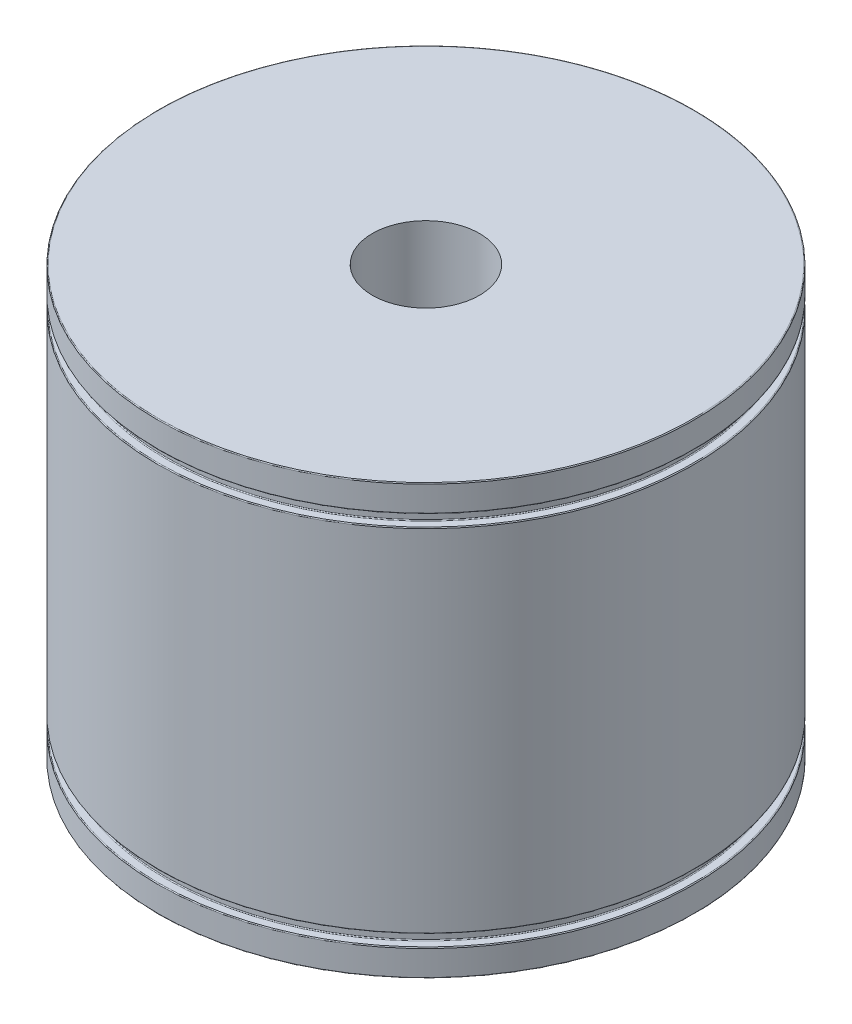
ISO-10303-21;
HEADER;
FILE_DESCRIPTION(('STEP AP214'),'2;1');
FILE_NAME('part.step','',(''),(''),'','','');
FILE_SCHEMA(('AUTOMOTIVE_DESIGN { 1 0 10303 214 1 1 1 1 }'));
ENDSEC;
DATA;
#1=APPLICATION_CONTEXT('core data for automotive mechanical design processes');
#2=APPLICATION_PROTOCOL_DEFINITION('international standard','automotive_design',2000,#1);
#3=PRODUCT_CONTEXT('',#1,'mechanical');
#4=PRODUCT('Part','Part','',(#3));
#5=PRODUCT_RELATED_PRODUCT_CATEGORY('part','',(#4));
#6=PRODUCT_DEFINITION_FORMATION('','',#4);
#7=PRODUCT_DEFINITION_CONTEXT('part definition',#1,'design');
#8=PRODUCT_DEFINITION('design','',#6,#7);
#9=PRODUCT_DEFINITION_SHAPE('','',#8);
#10=(LENGTH_UNIT() NAMED_UNIT(*) SI_UNIT(.MILLI.,.METRE.));
#11=(NAMED_UNIT(*) PLANE_ANGLE_UNIT() SI_UNIT($,.RADIAN.));
#12=(NAMED_UNIT(*) SI_UNIT($,.STERADIAN.) SOLID_ANGLE_UNIT());
#13=UNCERTAINTY_MEASURE_WITH_UNIT(LENGTH_MEASURE(1.E-05),#10,'distance_accuracy_value','');
#14=(GEOMETRIC_REPRESENTATION_CONTEXT(3) GLOBAL_UNCERTAINTY_ASSIGNED_CONTEXT((#13)) GLOBAL_UNIT_ASSIGNED_CONTEXT((#10,
#11,#12)) REPRESENTATION_CONTEXT('',''));
#15=CARTESIAN_POINT('',(0.,0.,0.));
#16=DIRECTION('',(0.,0.,1.));
#17=DIRECTION('',(1.,0.,0.));
#18=AXIS2_PLACEMENT_3D('',#15,#16,#17);
#19=CARTESIAN_POINT('',(0.,25.4,0.));
#20=DIRECTION('',(0.,1.,0.));
#21=DIRECTION('',(0.,0.,1.));
#22=AXIS2_PLACEMENT_3D('',#19,#20,#21);
#23=CYLINDRICAL_SURFACE('',#22,6.35000000000001);
#24=CARTESIAN_POINT('',(0.,-25.4,0.));
#25=DIRECTION('',(0.,1.,0.));
#26=DIRECTION('',(0.,0.,1.));
#27=AXIS2_PLACEMENT_3D('',#24,#25,#26);
#28=CIRCLE('',#27,6.35000000000001);
#29=CARTESIAN_POINT('',(0.,-25.4,6.35000000000001));
#30=VERTEX_POINT('',#29);
#31=EDGE_CURVE('E747',#30,#30,#28,.F.);
#32=ORIENTED_EDGE('',*,*,#31,.T.);
#33=EDGE_LOOP('',(#32));
#34=FACE_BOUND('',#33,.T.);
#35=CARTESIAN_POINT('',(0.,25.4,0.));
#36=DIRECTION('',(0.,1.,0.));
#37=DIRECTION('',(0.,0.,1.));
#38=AXIS2_PLACEMENT_3D('',#35,#36,#37);
#39=CIRCLE('',#38,6.35000000000001);
#40=CARTESIAN_POINT('',(0.,25.4,6.35000000000001));
#41=VERTEX_POINT('',#40);
#42=EDGE_CURVE('E100',#41,#41,#39,.T.);
#43=ORIENTED_EDGE('',*,*,#42,.T.);
#44=EDGE_LOOP('',(#43));
#45=FACE_BOUND('',#44,.T.);
#46=ADVANCED_FACE('F17',(#34,#45),#23,.F.);
#47=CARTESIAN_POINT('',(31.65,-25.4,0.));
#48=DIRECTION('',(0.,1.,0.));
#49=DIRECTION('',(0.,0.,1.));
#50=AXIS2_PLACEMENT_3D('',#47,#48,#49);
#51=PLANE('',#50);
#52=ORIENTED_EDGE('',*,*,#31,.F.);
#53=EDGE_LOOP('',(#52));
#54=FACE_BOUND('',#53,.T.);
#55=CARTESIAN_POINT('',(0.,-25.4,0.));
#56=DIRECTION('',(0.,1.,0.));
#57=DIRECTION('',(0.,0.,-1.));
#58=AXIS2_PLACEMENT_3D('',#55,#56,#57);
#59=CIRCLE('',#58,31.65);
#60=CARTESIAN_POINT('',(0.,-25.4,-31.65));
#61=VERTEX_POINT('',#60);
#62=CARTESIAN_POINT('',(0.,-25.4,31.65));
#63=VERTEX_POINT('',#62);
#64=EDGE_CURVE('E96',#61,#63,#59,.T.);
#65=ORIENTED_EDGE('',*,*,#64,.F.);
#66=CARTESIAN_POINT('',(0.,-25.4,0.));
#67=DIRECTION('',(0.,1.,0.));
#68=DIRECTION('',(0.,0.,1.));
#69=AXIS2_PLACEMENT_3D('',#66,#67,#68);
#70=CIRCLE('',#69,31.65);
#71=EDGE_CURVE('E93',#63,#61,#70,.T.);
#72=ORIENTED_EDGE('',*,*,#71,.F.);
#73=EDGE_LOOP('',(#65,#72));
#74=FACE_BOUND('',#73,.T.);
#75=ADVANCED_FACE('F98',(#54,#74),#51,.F.);
#76=CARTESIAN_POINT('',(6.35000000000001,25.4,0.));
#77=DIRECTION('',(0.,-1.,0.));
#78=DIRECTION('',(0.,0.,-1.));
#79=AXIS2_PLACEMENT_3D('',#76,#77,#78);
#80=PLANE('',#79);
#81=CARTESIAN_POINT('',(0.,25.4,0.));
#82=DIRECTION('',(0.,-1.,0.));
#83=DIRECTION('',(0.,0.,1.));
#84=AXIS2_PLACEMENT_3D('',#81,#82,#83);
#85=CIRCLE('',#84,31.65);
#86=CARTESIAN_POINT('',(0.,25.4,31.65));
#87=VERTEX_POINT('',#86);
#88=CARTESIAN_POINT('',(0.,25.4,-31.65));
#89=VERTEX_POINT('',#88);
#90=EDGE_CURVE('E105',#87,#89,#85,.T.);
#91=ORIENTED_EDGE('',*,*,#90,.F.);
#92=CARTESIAN_POINT('',(0.,25.4,0.));
#93=DIRECTION('',(0.,-1.,0.));
#94=DIRECTION('',(0.,0.,-1.));
#95=AXIS2_PLACEMENT_3D('',#92,#93,#94);
#96=CIRCLE('',#95,31.65);
#97=EDGE_CURVE('E149',#89,#87,#96,.T.);
#98=ORIENTED_EDGE('',*,*,#97,.F.);
#99=EDGE_LOOP('',(#91,#98));
#100=FACE_BOUND('',#99,.T.);
#101=ORIENTED_EDGE('',*,*,#42,.F.);
#102=EDGE_LOOP('',(#101));
#103=FACE_BOUND('',#102,.T.);
#104=ADVANCED_FACE('F125',(#100,#103),#80,.F.);
#105=CARTESIAN_POINT('',(0.,-25.3,0.));
#106=DIRECTION('',(0.,1.,0.));
#107=DIRECTION('',(0.,0.,1.));
#108=AXIS2_PLACEMENT_3D('',#105,#106,#107);
#109=TOROIDAL_SURFACE('',#108,31.65,0.100000000000001);
#110=CARTESIAN_POINT('',(0.,-25.3,0.));
#111=DIRECTION('',(0.,1.,0.));
#112=DIRECTION('',(0.,0.,1.));
#113=AXIS2_PLACEMENT_3D('',#110,#111,#112);
#114=CIRCLE('',#113,31.75);
#115=CARTESIAN_POINT('',(0.,-25.3,31.75));
#116=VERTEX_POINT('',#115);
#117=EDGE_CURVE('E135',#116,#116,#114,.T.);
#118=ORIENTED_EDGE('',*,*,#117,.F.);
#119=EDGE_LOOP('',(#118));
#120=FACE_BOUND('',#119,.T.);
#121=ORIENTED_EDGE('',*,*,#71,.T.);
#122=ORIENTED_EDGE('',*,*,#64,.T.);
#123=EDGE_LOOP('',(#121,#122));
#124=FACE_BOUND('',#123,.T.);
#125=ADVANCED_FACE('F104',(#120,#124),#109,.T.);
#126=CARTESIAN_POINT('',(0.,25.3,0.));
#127=DIRECTION('',(0.,1.,0.));
#128=DIRECTION('',(0.,0.,1.));
#129=AXIS2_PLACEMENT_3D('',#126,#127,#128);
#130=TOROIDAL_SURFACE('',#129,31.65,0.100000000000001);
#131=ORIENTED_EDGE('',*,*,#90,.T.);
#132=ORIENTED_EDGE('',*,*,#97,.T.);
#133=EDGE_LOOP('',(#131,#132));
#134=FACE_BOUND('',#133,.T.);
#135=CARTESIAN_POINT('',(0.,25.3,0.));
#136=DIRECTION('',(0.,1.,0.));
#137=DIRECTION('',(0.,0.,1.));
#138=AXIS2_PLACEMENT_3D('',#135,#136,#137);
#139=CIRCLE('',#138,31.75);
#140=CARTESIAN_POINT('',(0.,25.3,31.75));
#141=VERTEX_POINT('',#140);
#142=EDGE_CURVE('E169',#141,#141,#139,.F.);
#143=ORIENTED_EDGE('',*,*,#142,.F.);
#144=EDGE_LOOP('',(#143));
#145=FACE_BOUND('',#144,.T.);
#146=ADVANCED_FACE('F124',(#134,#145),#130,.T.);
#147=CARTESIAN_POINT('',(0.,25.4,0.));
#148=DIRECTION('',(0.,1.,0.));
#149=DIRECTION('',(0.,0.,1.));
#150=AXIS2_PLACEMENT_3D('',#147,#148,#149);
#151=CYLINDRICAL_SURFACE('',#150,31.75);
#152=CARTESIAN_POINT('',(0.,-22.3332876802199,0.));
#153=DIRECTION('',(0.,1.,0.));
#154=DIRECTION('',(0.,0.,1.));
#155=AXIS2_PLACEMENT_3D('',#152,#153,#154);
#156=CIRCLE('',#155,31.75);
#157=CARTESIAN_POINT('',(0.,-22.3332876802199,31.75));
#158=VERTEX_POINT('',#157);
#159=EDGE_CURVE('E173',#158,#158,#156,.T.);
#160=ORIENTED_EDGE('',*,*,#159,.F.);
#161=EDGE_LOOP('',(#160));
#162=FACE_BOUND('',#161,.T.);
#163=ORIENTED_EDGE('',*,*,#117,.T.);
#164=EDGE_LOOP('',(#163));
#165=FACE_BOUND('',#164,.T.);
#166=ADVANCED_FACE('F692',(#162,#165),#151,.T.);
#167=CARTESIAN_POINT('',(0.,25.4,0.));
#168=DIRECTION('',(0.,1.,0.));
#169=DIRECTION('',(0.,0.,1.));
#170=AXIS2_PLACEMENT_3D('',#167,#168,#169);
#171=CYLINDRICAL_SURFACE('',#170,31.75);
#172=ORIENTED_EDGE('',*,*,#142,.T.);
#173=EDGE_LOOP('',(#172));
#174=FACE_BOUND('',#173,.T.);
#175=CARTESIAN_POINT('',(0.,22.3332876802199,0.));
#176=DIRECTION('',(0.,1.,0.));
#177=DIRECTION('',(0.,0.,1.));
#178=AXIS2_PLACEMENT_3D('',#175,#176,#177);
#179=CIRCLE('',#178,31.75);
#180=CARTESIAN_POINT('',(0.,22.3332876802199,31.75));
#181=VERTEX_POINT('',#180);
#182=EDGE_CURVE('E178',#181,#181,#179,.F.);
#183=ORIENTED_EDGE('',*,*,#182,.F.);
#184=EDGE_LOOP('',(#183));
#185=FACE_BOUND('',#184,.T.);
#186=ADVANCED_FACE('F201',(#174,#185),#171,.T.);
#187=CARTESIAN_POINT('',(0.,-22.3332876802199,0.));
#188=DIRECTION('',(0.,1.,0.));
#189=DIRECTION('',(0.,0.,1.));
#190=AXIS2_PLACEMENT_3D('',#187,#188,#189);
#191=TOROIDAL_SURFACE('',#190,31.65,0.0999999999999977);
#192=CARTESIAN_POINT('',(0.,-22.2332876802199,0.));
#193=DIRECTION('',(0.,-1.,0.));
#194=DIRECTION('',(0.,0.,1.));
#195=AXIS2_PLACEMENT_3D('',#192,#193,#194);
#196=CIRCLE('',#195,31.65);
#197=CARTESIAN_POINT('',(0.,-22.2332876802199,31.65));
#198=VERTEX_POINT('',#197);
#199=CARTESIAN_POINT('',(0.,-22.2332876802199,-31.65));
#200=VERTEX_POINT('',#199);
#201=EDGE_CURVE('E184',#198,#200,#196,.T.);
#202=ORIENTED_EDGE('',*,*,#201,.T.);
#203=CARTESIAN_POINT('',(0.,-22.2332876802199,0.));
#204=DIRECTION('',(0.,-1.,0.));
#205=DIRECTION('',(0.,0.,-1.));
#206=AXIS2_PLACEMENT_3D('',#203,#204,#205);
#207=CIRCLE('',#206,31.65);
#208=EDGE_CURVE('E339',#200,#198,#207,.T.);
#209=ORIENTED_EDGE('',*,*,#208,.T.);
#210=EDGE_LOOP('',(#202,#209));
#211=FACE_BOUND('',#210,.T.);
#212=ORIENTED_EDGE('',*,*,#159,.T.);
#213=EDGE_LOOP('',(#212));
#214=FACE_BOUND('',#213,.T.);
#215=ADVANCED_FACE('F190',(#211,#214),#191,.T.);
#216=CARTESIAN_POINT('',(0.,22.3332876802199,0.));
#217=DIRECTION('',(0.,1.,0.));
#218=DIRECTION('',(0.,0.,1.));
#219=AXIS2_PLACEMENT_3D('',#216,#217,#218);
#220=TOROIDAL_SURFACE('',#219,31.65,0.0999999999999977);
#221=ORIENTED_EDGE('',*,*,#182,.T.);
#222=EDGE_LOOP('',(#221));
#223=FACE_BOUND('',#222,.T.);
#224=CARTESIAN_POINT('',(0.,22.2332876802199,0.));
#225=DIRECTION('',(0.,1.,0.));
#226=DIRECTION('',(0.,0.,1.));
#227=AXIS2_PLACEMENT_3D('',#224,#225,#226);
#228=CIRCLE('',#227,31.65);
#229=CARTESIAN_POINT('',(0.,22.2332876802199,31.65));
#230=VERTEX_POINT('',#229);
#231=CARTESIAN_POINT('',(0.,22.2332876802199,-31.65));
#232=VERTEX_POINT('',#231);
#233=EDGE_CURVE('E219',#230,#232,#228,.T.);
#234=ORIENTED_EDGE('',*,*,#233,.T.);
#235=CARTESIAN_POINT('',(0.,22.2332876802199,0.));
#236=DIRECTION('',(0.,1.,0.));
#237=DIRECTION('',(0.,0.,-1.));
#238=AXIS2_PLACEMENT_3D('',#235,#236,#237);
#239=CIRCLE('',#238,31.65);
#240=EDGE_CURVE('E254',#232,#230,#239,.T.);
#241=ORIENTED_EDGE('',*,*,#240,.T.);
#242=EDGE_LOOP('',(#234,#241));
#243=FACE_BOUND('',#242,.T.);
#244=ADVANCED_FACE('F200',(#223,#243),#220,.T.);
#245=CARTESIAN_POINT('',(31.65,-22.2332876802199,0.));
#246=DIRECTION('',(0.,-1.,0.));
#247=DIRECTION('',(0.,0.,-1.));
#248=AXIS2_PLACEMENT_3D('',#245,#246,#247);
#249=PLANE('',#248);
#250=ORIENTED_EDGE('',*,*,#201,.F.);
#251=ORIENTED_EDGE('',*,*,#208,.F.);
#252=EDGE_LOOP('',(#250,#251));
#253=FACE_BOUND('',#252,.T.);
#254=CARTESIAN_POINT('',(0.,-22.2332876802199,0.));
#255=DIRECTION('',(0.,1.,0.));
#256=DIRECTION('',(0.,0.,-1.));
#257=AXIS2_PLACEMENT_3D('',#254,#255,#256);
#258=CIRCLE('',#257,30.7986025440302);
#259=CARTESIAN_POINT('',(0.,-22.2332876802199,30.7986025440302));
#260=VERTEX_POINT('',#259);
#261=CARTESIAN_POINT('',(0.,-22.2332876802199,-30.7986025440302));
#262=VERTEX_POINT('',#261);
#263=EDGE_CURVE('E308',#260,#262,#258,.F.);
#264=ORIENTED_EDGE('',*,*,#263,.T.);
#265=CARTESIAN_POINT('',(0.,-22.2332876802199,0.));
#266=DIRECTION('',(0.,1.,0.));
#267=DIRECTION('',(0.,0.,1.));
#268=AXIS2_PLACEMENT_3D('',#265,#266,#267);
#269=CIRCLE('',#268,30.7986025440302);
#270=EDGE_CURVE('E450',#262,#260,#269,.F.);
#271=ORIENTED_EDGE('',*,*,#270,.T.);
#272=EDGE_LOOP('',(#264,#271));
#273=FACE_BOUND('',#272,.T.);
#274=ADVANCED_FACE('F313',(#253,#273),#249,.F.);
#275=CARTESIAN_POINT('',(31.65,22.2332876802199,0.));
#276=DIRECTION('',(0.,1.,0.));
#277=DIRECTION('',(0.,0.,1.));
#278=AXIS2_PLACEMENT_3D('',#275,#276,#277);
#279=PLANE('',#278);
#280=CARTESIAN_POINT('',(0.,22.2332876802199,0.));
#281=DIRECTION('',(0.,-1.,0.));
#282=DIRECTION('',(0.,0.,1.));
#283=AXIS2_PLACEMENT_3D('',#280,#281,#282);
#284=CIRCLE('',#283,30.7986025440302);
#285=CARTESIAN_POINT('',(0.,22.2332876802199,-30.7986025440302));
#286=VERTEX_POINT('',#285);
#287=CARTESIAN_POINT('',(0.,22.2332876802199,30.7986025440302));
#288=VERTEX_POINT('',#287);
#289=EDGE_CURVE('E275',#286,#288,#284,.F.);
#290=ORIENTED_EDGE('',*,*,#289,.T.);
#291=CARTESIAN_POINT('',(0.,22.2332876802199,0.));
#292=DIRECTION('',(0.,-1.,0.));
#293=DIRECTION('',(0.,0.,-1.));
#294=AXIS2_PLACEMENT_3D('',#291,#292,#293);
#295=CIRCLE('',#294,30.7986025440302);
#296=EDGE_CURVE('E286',#288,#286,#295,.F.);
#297=ORIENTED_EDGE('',*,*,#296,.T.);
#298=EDGE_LOOP('',(#290,#297));
#299=FACE_BOUND('',#298,.T.);
#300=ORIENTED_EDGE('',*,*,#240,.F.);
#301=ORIENTED_EDGE('',*,*,#233,.F.);
#302=EDGE_LOOP('',(#300,#301));
#303=FACE_BOUND('',#302,.T.);
#304=ADVANCED_FACE('F241',(#299,#303),#279,.F.);
#305=CARTESIAN_POINT('',(0.,-22.1332876802199,0.));
#306=DIRECTION('',(0.,1.,0.));
#307=DIRECTION('',(0.,0.,1.));
#308=AXIS2_PLACEMENT_3D('',#305,#306,#307);
#309=TOROIDAL_SURFACE('',#308,30.7986025440302,0.0999999999999959);
#310=CARTESIAN_POINT('',(0.,-22.1332876802199,0.));
#311=DIRECTION('',(0.,1.,0.));
#312=DIRECTION('',(0.,0.,1.));
#313=AXIS2_PLACEMENT_3D('',#310,#311,#312);
#314=CIRCLE('',#313,30.6986025440302);
#315=CARTESIAN_POINT('',(0.,-22.1332876802199,30.6986025440302));
#316=VERTEX_POINT('',#315);
#317=EDGE_CURVE('E251',#316,#316,#314,.T.);
#318=ORIENTED_EDGE('',*,*,#317,.F.);
#319=EDGE_LOOP('',(#318));
#320=FACE_BOUND('',#319,.T.);
#321=ORIENTED_EDGE('',*,*,#263,.F.);
#322=ORIENTED_EDGE('',*,*,#270,.F.);
#323=EDGE_LOOP('',(#321,#322));
#324=FACE_BOUND('',#323,.T.);
#325=ADVANCED_FACE('F229',(#320,#324),#309,.F.);
#326=CARTESIAN_POINT('',(0.,22.1332876802199,0.));
#327=DIRECTION('',(0.,1.,0.));
#328=DIRECTION('',(0.,0.,1.));
#329=AXIS2_PLACEMENT_3D('',#326,#327,#328);
#330=TOROIDAL_SURFACE('',#329,30.7986025440302,0.0999999999999959);
#331=ORIENTED_EDGE('',*,*,#296,.F.);
#332=ORIENTED_EDGE('',*,*,#289,.F.);
#333=EDGE_LOOP('',(#331,#332));
#334=FACE_BOUND('',#333,.T.);
#335=CARTESIAN_POINT('',(0.,22.1332876802199,0.));
#336=DIRECTION('',(0.,1.,0.));
#337=DIRECTION('',(0.,0.,1.));
#338=AXIS2_PLACEMENT_3D('',#335,#336,#337);
#339=CIRCLE('',#338,30.6986025440302);
#340=CARTESIAN_POINT('',(0.,22.1332876802199,30.6986025440302));
#341=VERTEX_POINT('',#340);
#342=EDGE_CURVE('E442',#341,#341,#339,.F.);
#343=ORIENTED_EDGE('',*,*,#342,.F.);
#344=EDGE_LOOP('',(#343));
#345=FACE_BOUND('',#344,.T.);
#346=ADVANCED_FACE('F240',(#334,#345),#330,.F.);
#347=CARTESIAN_POINT('',(0.,25.4,0.));
#348=DIRECTION('',(0.,1.,0.));
#349=DIRECTION('',(0.,0.,1.));
#350=AXIS2_PLACEMENT_3D('',#347,#348,#349);
#351=CYLINDRICAL_SURFACE('',#350,30.6986025440302);
#352=CARTESIAN_POINT('',(0.,-20.9361946855747,0.));
#353=DIRECTION('',(0.,1.,0.));
#354=DIRECTION('',(0.,0.,1.));
#355=AXIS2_PLACEMENT_3D('',#352,#353,#354);
#356=CIRCLE('',#355,30.6986025440302);
#357=CARTESIAN_POINT('',(0.,-20.9361946855747,30.6986025440302));
#358=VERTEX_POINT('',#357);
#359=EDGE_CURVE('E439',#358,#358,#356,.F.);
#360=ORIENTED_EDGE('',*,*,#359,.T.);
#361=EDGE_LOOP('',(#360));
#362=FACE_BOUND('',#361,.T.);
#363=ORIENTED_EDGE('',*,*,#317,.T.);
#364=EDGE_LOOP('',(#363));
#365=FACE_BOUND('',#364,.T.);
#366=ADVANCED_FACE('F451',(#362,#365),#351,.T.);
#367=CARTESIAN_POINT('',(0.,25.4,0.));
#368=DIRECTION('',(0.,1.,0.));
#369=DIRECTION('',(0.,0.,1.));
#370=AXIS2_PLACEMENT_3D('',#367,#368,#369);
#371=CYLINDRICAL_SURFACE('',#370,30.6986025440302);
#372=ORIENTED_EDGE('',*,*,#342,.T.);
#373=EDGE_LOOP('',(#372));
#374=FACE_BOUND('',#373,.T.);
#375=CARTESIAN_POINT('',(0.,20.9361946855747,0.));
#376=DIRECTION('',(0.,1.,0.));
#377=DIRECTION('',(0.,0.,1.));
#378=AXIS2_PLACEMENT_3D('',#375,#376,#377);
#379=CIRCLE('',#378,30.6986025440302);
#380=CARTESIAN_POINT('',(0.,20.9361946855747,30.6986025440302));
#381=VERTEX_POINT('',#380);
#382=EDGE_CURVE('E430',#381,#381,#379,.T.);
#383=ORIENTED_EDGE('',*,*,#382,.T.);
#384=EDGE_LOOP('',(#383));
#385=FACE_BOUND('',#384,.T.);
#386=ADVANCED_FACE('F411',(#374,#385),#371,.T.);
#387=CARTESIAN_POINT('',(0.,-20.9361946855747,0.));
#388=DIRECTION('',(0.,1.,0.));
#389=DIRECTION('',(0.,0.,1.));
#390=AXIS2_PLACEMENT_3D('',#387,#388,#389);
#391=TOROIDAL_SURFACE('',#390,30.7986025440302,0.100000000000001);
#392=CARTESIAN_POINT('',(0.,-20.8361946855747,0.));
#393=DIRECTION('',(0.,-1.,0.));
#394=DIRECTION('',(0.,0.,-1.));
#395=AXIS2_PLACEMENT_3D('',#392,#393,#394);
#396=CIRCLE('',#395,30.7986025440302);
#397=CARTESIAN_POINT('',(0.,-20.8361946855747,-30.7986025440302));
#398=VERTEX_POINT('',#397);
#399=CARTESIAN_POINT('',(0.,-20.8361946855747,30.7986025440302));
#400=VERTEX_POINT('',#399);
#401=EDGE_CURVE('E425',#398,#400,#396,.T.);
#402=ORIENTED_EDGE('',*,*,#401,.T.);
#403=CARTESIAN_POINT('',(0.,-20.8361946855747,0.));
#404=DIRECTION('',(0.,-1.,0.));
#405=DIRECTION('',(0.,0.,1.));
#406=AXIS2_PLACEMENT_3D('',#403,#404,#405);
#407=CIRCLE('',#406,30.7986025440302);
#408=EDGE_CURVE('E438',#400,#398,#407,.T.);
#409=ORIENTED_EDGE('',*,*,#408,.T.);
#410=EDGE_LOOP('',(#402,#409));
#411=FACE_BOUND('',#410,.T.);
#412=ORIENTED_EDGE('',*,*,#359,.F.);
#413=EDGE_LOOP('',(#412));
#414=FACE_BOUND('',#413,.T.);
#415=ADVANCED_FACE('F399',(#411,#414),#391,.F.);
#416=CARTESIAN_POINT('',(0.,20.9361946855747,0.));
#417=DIRECTION('',(0.,1.,0.));
#418=DIRECTION('',(0.,0.,1.));
#419=AXIS2_PLACEMENT_3D('',#416,#417,#418);
#420=TOROIDAL_SURFACE('',#419,30.7986025440302,0.100000000000001);
#421=ORIENTED_EDGE('',*,*,#382,.F.);
#422=EDGE_LOOP('',(#421));
#423=FACE_BOUND('',#422,.T.);
#424=CARTESIAN_POINT('',(0.,20.8361946855747,0.));
#425=DIRECTION('',(0.,1.,0.));
#426=DIRECTION('',(0.,0.,-1.));
#427=AXIS2_PLACEMENT_3D('',#424,#425,#426);
#428=CIRCLE('',#427,30.7986025440302);
#429=CARTESIAN_POINT('',(0.,20.8361946855747,-30.7986025440302));
#430=VERTEX_POINT('',#429);
#431=CARTESIAN_POINT('',(0.,20.8361946855747,30.7986025440302));
#432=VERTEX_POINT('',#431);
#433=EDGE_CURVE('E487',#430,#432,#428,.T.);
#434=ORIENTED_EDGE('',*,*,#433,.T.);
#435=CARTESIAN_POINT('',(0.,20.8361946855747,0.));
#436=DIRECTION('',(0.,1.,0.));
#437=DIRECTION('',(0.,0.,1.));
#438=AXIS2_PLACEMENT_3D('',#435,#436,#437);
#439=CIRCLE('',#438,30.7986025440302);
#440=EDGE_CURVE('E587',#432,#430,#439,.T.);
#441=ORIENTED_EDGE('',*,*,#440,.T.);
#442=EDGE_LOOP('',(#434,#441));
#443=FACE_BOUND('',#442,.T.);
#444=ADVANCED_FACE('F410',(#423,#443),#420,.F.);
#445=CARTESIAN_POINT('',(30.7986025440302,-20.8361946855747,0.));
#446=DIRECTION('',(0.,1.,0.));
#447=DIRECTION('',(0.,0.,1.));
#448=AXIS2_PLACEMENT_3D('',#445,#446,#447);
#449=PLANE('',#448);
#450=ORIENTED_EDGE('',*,*,#408,.F.);
#451=ORIENTED_EDGE('',*,*,#401,.F.);
#452=EDGE_LOOP('',(#450,#451));
#453=FACE_BOUND('',#452,.T.);
#454=CARTESIAN_POINT('',(0.,-20.8361946855747,0.));
#455=DIRECTION('',(0.,1.,0.));
#456=DIRECTION('',(0.,0.,-1.));
#457=AXIS2_PLACEMENT_3D('',#454,#455,#456);
#458=CIRCLE('',#457,31.65);
#459=CARTESIAN_POINT('',(0.,-20.8361946855747,-31.65));
#460=VERTEX_POINT('',#459);
#461=CARTESIAN_POINT('',(0.,-20.8361946855747,31.65));
#462=VERTEX_POINT('',#461);
#463=EDGE_CURVE('E537',#460,#462,#458,.T.);
#464=ORIENTED_EDGE('',*,*,#463,.F.);
#465=CARTESIAN_POINT('',(0.,-20.8361946855747,0.));
#466=DIRECTION('',(0.,1.,0.));
#467=DIRECTION('',(0.,0.,1.));
#468=AXIS2_PLACEMENT_3D('',#465,#466,#467);
#469=CIRCLE('',#468,31.65);
#470=EDGE_CURVE('E548',#462,#460,#469,.T.);
#471=ORIENTED_EDGE('',*,*,#470,.F.);
#472=EDGE_LOOP('',(#464,#471));
#473=FACE_BOUND('',#472,.T.);
#474=ADVANCED_FACE('F500',(#453,#473),#449,.F.);
#475=CARTESIAN_POINT('',(30.7986025440302,20.8361946855747,0.));
#476=DIRECTION('',(0.,-1.,0.));
#477=DIRECTION('',(0.,0.,-1.));
#478=AXIS2_PLACEMENT_3D('',#475,#476,#477);
#479=PLANE('',#478);
#480=CARTESIAN_POINT('',(0.,20.8361946855747,0.));
#481=DIRECTION('',(0.,-1.,0.));
#482=DIRECTION('',(0.,0.,1.));
#483=AXIS2_PLACEMENT_3D('',#480,#481,#482);
#484=CIRCLE('',#483,31.65);
#485=CARTESIAN_POINT('',(0.,20.8361946855747,31.65));
#486=VERTEX_POINT('',#485);
#487=CARTESIAN_POINT('',(0.,20.8361946855747,-31.65));
#488=VERTEX_POINT('',#487);
#489=EDGE_CURVE('E36',#486,#488,#484,.T.);
#490=ORIENTED_EDGE('',*,*,#489,.F.);
#491=CARTESIAN_POINT('',(0.,20.8361946855747,0.));
#492=DIRECTION('',(0.,-1.,0.));
#493=DIRECTION('',(0.,0.,-1.));
#494=AXIS2_PLACEMENT_3D('',#491,#492,#493);
#495=CIRCLE('',#494,31.65);
#496=EDGE_CURVE('E517',#488,#486,#495,.T.);
#497=ORIENTED_EDGE('',*,*,#496,.F.);
#498=EDGE_LOOP('',(#490,#497));
#499=FACE_BOUND('',#498,.T.);
#500=ORIENTED_EDGE('',*,*,#433,.F.);
#501=ORIENTED_EDGE('',*,*,#440,.F.);
#502=EDGE_LOOP('',(#500,#501));
#503=FACE_BOUND('',#502,.T.);
#504=ADVANCED_FACE('F492',(#499,#503),#479,.F.);
#505=CARTESIAN_POINT('',(0.,-20.7361946855747,0.));
#506=DIRECTION('',(0.,1.,0.));
#507=DIRECTION('',(0.,0.,1.));
#508=AXIS2_PLACEMENT_3D('',#505,#506,#507);
#509=TOROIDAL_SURFACE('',#508,31.65,0.0999999999999977);
#510=CARTESIAN_POINT('',(0.,-20.7361946855747,0.));
#511=DIRECTION('',(0.,1.,0.));
#512=DIRECTION('',(0.,0.,1.));
#513=AXIS2_PLACEMENT_3D('',#510,#511,#512);
#514=CIRCLE('',#513,31.75);
#515=CARTESIAN_POINT('',(0.,-20.7361946855747,31.75));
#516=VERTEX_POINT('',#515);
#517=EDGE_CURVE('E28',#516,#516,#514,.T.);
#518=ORIENTED_EDGE('',*,*,#517,.F.);
#519=EDGE_LOOP('',(#518));
#520=FACE_BOUND('',#519,.T.);
#521=ORIENTED_EDGE('',*,*,#470,.T.);
#522=ORIENTED_EDGE('',*,*,#463,.T.);
#523=EDGE_LOOP('',(#521,#522));
#524=FACE_BOUND('',#523,.T.);
#525=ADVANCED_FACE('F467',(#520,#524),#509,.T.);
#526=CARTESIAN_POINT('',(0.,20.7361946855747,0.));
#527=DIRECTION('',(0.,1.,0.));
#528=DIRECTION('',(0.,0.,1.));
#529=AXIS2_PLACEMENT_3D('',#526,#527,#528);
#530=TOROIDAL_SURFACE('',#529,31.65,0.0999999999999977);
#531=ORIENTED_EDGE('',*,*,#489,.T.);
#532=ORIENTED_EDGE('',*,*,#496,.T.);
#533=EDGE_LOOP('',(#531,#532));
#534=FACE_BOUND('',#533,.T.);
#535=CARTESIAN_POINT('',(0.,20.7361946855747,0.));
#536=DIRECTION('',(0.,1.,0.));
#537=DIRECTION('',(0.,0.,1.));
#538=AXIS2_PLACEMENT_3D('',#535,#536,#537);
#539=CIRCLE('',#538,31.75);
#540=CARTESIAN_POINT('',(0.,20.7361946855747,31.75));
#541=VERTEX_POINT('',#540);
#542=EDGE_CURVE('E11',#541,#541,#539,.F.);
#543=ORIENTED_EDGE('',*,*,#542,.F.);
#544=EDGE_LOOP('',(#543));
#545=FACE_BOUND('',#544,.T.);
#546=ADVANCED_FACE('F461',(#534,#545),#530,.T.);
#547=CARTESIAN_POINT('',(0.,25.4,0.));
#548=DIRECTION('',(0.,1.,0.));
#549=DIRECTION('',(0.,0.,1.));
#550=AXIS2_PLACEMENT_3D('',#547,#548,#549);
#551=CYLINDRICAL_SURFACE('',#550,31.75);
#552=ORIENTED_EDGE('',*,*,#542,.T.);
#553=EDGE_LOOP('',(#552));
#554=FACE_BOUND('',#553,.T.);
#555=ORIENTED_EDGE('',*,*,#517,.T.);
#556=EDGE_LOOP('',(#555));
#557=FACE_BOUND('',#556,.T.);
#558=ADVANCED_FACE('F459',(#554,#557),#551,.T.);
#559=CLOSED_SHELL('',(#46,#75,#104,#125,#146,#166,#186,#215,#244,#274,#304,#325,#346,#366,#386,
#415,#444,#474,#504,#525,#546,#558));
#560=MANIFOLD_SOLID_BREP('B1',#559);
#561=ADVANCED_BREP_SHAPE_REPRESENTATION('',(#18,#560),#14);
#562=SHAPE_DEFINITION_REPRESENTATION(#9,#561);
ENDSEC;
END-ISO-10303-21;
